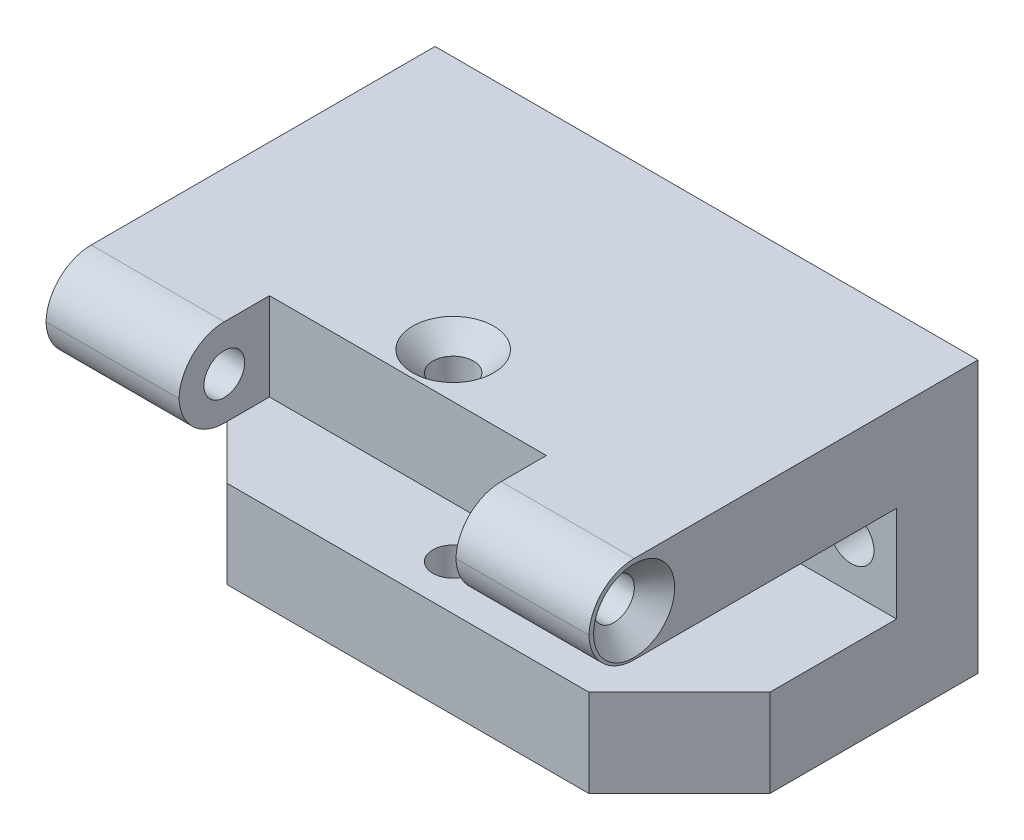
ISO-10303-21;
HEADER;
FILE_DESCRIPTION(('STEP AP214'),'2;1');
FILE_NAME('part.step','',(''),(''),'','','');
FILE_SCHEMA(('AUTOMOTIVE_DESIGN { 1 0 10303 214 1 1 1 1 }'));
ENDSEC;
DATA;
#1=APPLICATION_CONTEXT('core data for automotive mechanical design processes');
#2=APPLICATION_PROTOCOL_DEFINITION('international standard','automotive_design',2000,#1);
#3=PRODUCT_CONTEXT('',#1,'mechanical');
#4=PRODUCT('Part','Part','',(#3));
#5=PRODUCT_RELATED_PRODUCT_CATEGORY('part','',(#4));
#6=PRODUCT_DEFINITION_FORMATION('','',#4);
#7=PRODUCT_DEFINITION_CONTEXT('part definition',#1,'design');
#8=PRODUCT_DEFINITION('design','',#6,#7);
#9=PRODUCT_DEFINITION_SHAPE('','',#8);
#10=(LENGTH_UNIT() NAMED_UNIT(*) SI_UNIT(.MILLI.,.METRE.));
#11=(NAMED_UNIT(*) PLANE_ANGLE_UNIT() SI_UNIT($,.RADIAN.));
#12=(NAMED_UNIT(*) SI_UNIT($,.STERADIAN.) SOLID_ANGLE_UNIT());
#13=UNCERTAINTY_MEASURE_WITH_UNIT(LENGTH_MEASURE(1.E-05),#10,'distance_accuracy_value','');
#14=(GEOMETRIC_REPRESENTATION_CONTEXT(3) GLOBAL_UNCERTAINTY_ASSIGNED_CONTEXT((#13)) GLOBAL_UNIT_ASSIGNED_CONTEXT((#10,
#11,#12)) REPRESENTATION_CONTEXT('',''));
#15=CARTESIAN_POINT('',(0.,0.,0.));
#16=DIRECTION('',(0.,0.,1.));
#17=DIRECTION('',(1.,0.,0.));
#18=AXIS2_PLACEMENT_3D('',#15,#16,#17);
#19=CARTESIAN_POINT('',(30.,-15.,9.));
#20=DIRECTION('',(-1.,0.,0.));
#21=DIRECTION('',(0.,0.,1.));
#22=AXIS2_PLACEMENT_3D('',#19,#20,#21);
#23=PLANE('',#22);
#24=CARTESIAN_POINT('',(30.,9.99999999999999,38.));
#25=DIRECTION('',(-1.,0.,0.));
#26=DIRECTION('',(0.,0.,1.));
#27=AXIS2_PLACEMENT_3D('',#24,#25,#26);
#28=CIRCLE('',#27,5.);
#29=CARTESIAN_POINT('',(30.,15.,38.));
#30=VERTEX_POINT('',#29);
#31=CARTESIAN_POINT('',(30.,10.15,42.9977494935221));
#32=VERTEX_POINT('',#31);
#33=EDGE_CURVE('E354',#30,#32,#28,.F.);
#34=ORIENTED_EDGE('',*,*,#33,.T.);
#35=CARTESIAN_POINT('',(30.,10.3,38.));
#36=DIRECTION('',(-1.,0.,0.));
#37=DIRECTION('',(0.,0.,1.));
#38=AXIS2_PLACEMENT_3D('',#35,#36,#37);
#39=CIRCLE('',#38,5.);
#40=CARTESIAN_POINT('',(30.,5.3,38.));
#41=VERTEX_POINT('',#40);
#42=EDGE_CURVE('E357',#32,#41,#39,.F.);
#43=ORIENTED_EDGE('',*,*,#42,.T.);
#44=DIRECTION('',(0.,0.,-1.));
#45=VECTOR('',#44,1.);
#46=CARTESIAN_POINT('',(30.,5.3,33.));
#47=LINE('',#46,#45);
#48=CARTESIAN_POINT('',(30.,5.3,9.));
#49=VERTEX_POINT('',#48);
#50=EDGE_CURVE('E257',#41,#49,#47,.T.);
#51=ORIENTED_EDGE('',*,*,#50,.T.);
#52=DIRECTION('',(0.,1.,0.));
#53=VECTOR('',#52,1.);
#54=CARTESIAN_POINT('',(30.,-15.,9.));
#55=LINE('',#54,#53);
#56=CARTESIAN_POINT('',(30.,-5.3,9.));
#57=VERTEX_POINT('',#56);
#58=EDGE_CURVE('E267',#57,#49,#55,.T.);
#59=ORIENTED_EDGE('',*,*,#58,.F.);
#60=DIRECTION('',(0.,0.,-1.));
#61=VECTOR('',#60,1.);
#62=CARTESIAN_POINT('',(30.,-5.3,33.));
#63=LINE('',#62,#61);
#64=CARTESIAN_POINT('',(30.,-5.3,23.));
#65=VERTEX_POINT('',#64);
#66=EDGE_CURVE('E252',#65,#57,#63,.T.);
#67=ORIENTED_EDGE('',*,*,#66,.F.);
#68=DIRECTION('',(0.,-1.,0.));
#69=VECTOR('',#68,1.);
#70=CARTESIAN_POINT('',(30.,-15.,23.));
#71=LINE('',#70,#69);
#72=CARTESIAN_POINT('',(30.,-15.,23.));
#73=VERTEX_POINT('',#72);
#74=EDGE_CURVE('E325',#65,#73,#71,.T.);
#75=ORIENTED_EDGE('',*,*,#74,.T.);
#76=DIRECTION('',(0.,0.,-1.));
#77=VECTOR('',#76,1.);
#78=CARTESIAN_POINT('',(30.,-15.,9.));
#79=LINE('',#78,#77);
#80=CARTESIAN_POINT('',(30.,-15.,0.));
#81=VERTEX_POINT('',#80);
#82=EDGE_CURVE('E276',#73,#81,#79,.T.);
#83=ORIENTED_EDGE('',*,*,#82,.T.);
#84=DIRECTION('',(0.,1.,0.));
#85=VECTOR('',#84,1.);
#86=CARTESIAN_POINT('',(30.,-15.,0.));
#87=LINE('',#86,#85);
#88=CARTESIAN_POINT('',(30.,15.,0.));
#89=VERTEX_POINT('',#88);
#90=EDGE_CURVE('E266',#81,#89,#87,.T.);
#91=ORIENTED_EDGE('',*,*,#90,.T.);
#92=DIRECTION('',(0.,0.,-1.));
#93=VECTOR('',#92,1.);
#94=CARTESIAN_POINT('',(30.,15.,9.));
#95=LINE('',#94,#93);
#96=EDGE_CURVE('E299',#30,#89,#95,.T.);
#97=ORIENTED_EDGE('',*,*,#96,.F.);
#98=EDGE_LOOP('',(#34,#43,#51,#59,#67,#75,#83,#91,#97));
#99=FACE_BOUND('',#98,.T.);
#100=CARTESIAN_POINT('',(30.,9.99999999999999,38.));
#101=DIRECTION('',(1.,0.,0.));
#102=DIRECTION('',(0.,0.,-1.));
#103=AXIS2_PLACEMENT_3D('',#100,#101,#102);
#104=CIRCLE('',#103,4.48);
#105=CARTESIAN_POINT('',(30.,9.99999999999999,33.52));
#106=VERTEX_POINT('',#105);
#107=EDGE_CURVE('E374',#106,#106,#104,.T.);
#108=ORIENTED_EDGE('',*,*,#107,.F.);
#109=EDGE_LOOP('',(#108));
#110=FACE_BOUND('',#109,.T.);
#111=ADVANCED_FACE('F41',(#99,#110),#23,.F.);
#112=CARTESIAN_POINT('',(-30.,-15.,9.));
#113=DIRECTION('',(1.,0.,0.));
#114=DIRECTION('',(0.,0.,-1.));
#115=AXIS2_PLACEMENT_3D('',#112,#113,#114);
#116=PLANE('',#115);
#117=DIRECTION('',(0.,0.,-1.));
#118=VECTOR('',#117,1.);
#119=CARTESIAN_POINT('',(-30.,5.3,33.));
#120=LINE('',#119,#118);
#121=CARTESIAN_POINT('',(-30.,5.3,38.));
#122=VERTEX_POINT('',#121);
#123=CARTESIAN_POINT('',(-30.,5.3,9.));
#124=VERTEX_POINT('',#123);
#125=EDGE_CURVE('E263',#122,#124,#120,.T.);
#126=ORIENTED_EDGE('',*,*,#125,.F.);
#127=CARTESIAN_POINT('',(-30.,10.3,38.));
#128=DIRECTION('',(1.,0.,0.));
#129=DIRECTION('',(0.,0.,-1.));
#130=AXIS2_PLACEMENT_3D('',#127,#128,#129);
#131=CIRCLE('',#130,5.);
#132=CARTESIAN_POINT('',(-30.,10.15,42.9977494935221));
#133=VERTEX_POINT('',#132);
#134=EDGE_CURVE('E11',#122,#133,#131,.F.);
#135=ORIENTED_EDGE('',*,*,#134,.T.);
#136=CARTESIAN_POINT('',(-30.,9.99999999999999,38.));
#137=DIRECTION('',(1.,0.,0.));
#138=DIRECTION('',(0.,0.,-1.));
#139=AXIS2_PLACEMENT_3D('',#136,#137,#138);
#140=CIRCLE('',#139,5.);
#141=CARTESIAN_POINT('',(-30.,15.,38.));
#142=VERTEX_POINT('',#141);
#143=EDGE_CURVE('E51',#133,#142,#140,.F.);
#144=ORIENTED_EDGE('',*,*,#143,.T.);
#145=DIRECTION('',(0.,0.,-1.));
#146=VECTOR('',#145,1.);
#147=CARTESIAN_POINT('',(-30.,15.,9.));
#148=LINE('',#147,#146);
#149=CARTESIAN_POINT('',(-30.,15.,0.));
#150=VERTEX_POINT('',#149);
#151=EDGE_CURVE('E296',#142,#150,#148,.T.);
#152=ORIENTED_EDGE('',*,*,#151,.T.);
#153=DIRECTION('',(0.,-1.,0.));
#154=VECTOR('',#153,1.);
#155=CARTESIAN_POINT('',(-30.,-15.,0.));
#156=LINE('',#155,#154);
#157=CARTESIAN_POINT('',(-30.,-15.,0.));
#158=VERTEX_POINT('',#157);
#159=EDGE_CURVE('E284',#150,#158,#156,.T.);
#160=ORIENTED_EDGE('',*,*,#159,.T.);
#161=DIRECTION('',(0.,0.,-1.));
#162=VECTOR('',#161,1.);
#163=CARTESIAN_POINT('',(-30.,-15.,9.));
#164=LINE('',#163,#162);
#165=CARTESIAN_POINT('',(-30.,-15.,23.));
#166=VERTEX_POINT('',#165);
#167=EDGE_CURVE('E293',#166,#158,#164,.T.);
#168=ORIENTED_EDGE('',*,*,#167,.F.);
#169=DIRECTION('',(0.,1.,0.));
#170=VECTOR('',#169,1.);
#171=CARTESIAN_POINT('',(-30.,-5.3,23.));
#172=LINE('',#171,#170);
#173=CARTESIAN_POINT('',(-30.,-5.3,23.));
#174=VERTEX_POINT('',#173);
#175=EDGE_CURVE('E316',#166,#174,#172,.T.);
#176=ORIENTED_EDGE('',*,*,#175,.T.);
#177=DIRECTION('',(0.,0.,-1.));
#178=VECTOR('',#177,1.);
#179=CARTESIAN_POINT('',(-30.,-5.3,33.));
#180=LINE('',#179,#178);
#181=CARTESIAN_POINT('',(-30.,-5.3,9.));
#182=VERTEX_POINT('',#181);
#183=EDGE_CURVE('E246',#174,#182,#180,.T.);
#184=ORIENTED_EDGE('',*,*,#183,.T.);
#185=DIRECTION('',(0.,-1.,0.));
#186=VECTOR('',#185,1.);
#187=CARTESIAN_POINT('',(-30.,-15.,9.));
#188=LINE('',#187,#186);
#189=EDGE_CURVE('E271',#124,#182,#188,.T.);
#190=ORIENTED_EDGE('',*,*,#189,.F.);
#191=EDGE_LOOP('',(#126,#135,#144,#152,#160,#168,#176,#184,#190));
#192=FACE_BOUND('',#191,.T.);
#193=CARTESIAN_POINT('',(-30.,9.99999999999999,38.));
#194=DIRECTION('',(-1.,0.,0.));
#195=DIRECTION('',(0.,0.,1.));
#196=AXIS2_PLACEMENT_3D('',#193,#194,#195);
#197=CIRCLE('',#196,4.48);
#198=CARTESIAN_POINT('',(-30.,9.99999999999999,42.48));
#199=VERTEX_POINT('',#198);
#200=EDGE_CURVE('E448',#199,#199,#197,.T.);
#201=ORIENTED_EDGE('',*,*,#200,.F.);
#202=EDGE_LOOP('',(#201));
#203=FACE_BOUND('',#202,.T.);
#204=ADVANCED_FACE('F389',(#192,#203),#116,.F.);
#205=CARTESIAN_POINT('',(0.,0.,33.));
#206=DIRECTION('',(0.,0.,-1.));
#207=DIRECTION('',(-1.,0.,0.));
#208=AXIS2_PLACEMENT_3D('',#205,#206,#207);
#209=PLANE('',#208);
#210=DIRECTION('',(1.,0.,0.));
#211=VECTOR('',#210,1.);
#212=CARTESIAN_POINT('',(-30.,5.3,33.));
#213=LINE('',#212,#211);
#214=CARTESIAN_POINT('',(-15.3,5.3,33.));
#215=VERTEX_POINT('',#214);
#216=CARTESIAN_POINT('',(15.3,5.3,33.));
#217=VERTEX_POINT('',#216);
#218=EDGE_CURVE('E177',#215,#217,#213,.T.);
#219=ORIENTED_EDGE('',*,*,#218,.T.);
#220=DIRECTION('',(0.,1.,0.));
#221=VECTOR('',#220,1.);
#222=CARTESIAN_POINT('',(15.3,15.,33.));
#223=LINE('',#222,#221);
#224=CARTESIAN_POINT('',(15.3,15.,33.));
#225=VERTEX_POINT('',#224);
#226=EDGE_CURVE('E175',#217,#225,#223,.T.);
#227=ORIENTED_EDGE('',*,*,#226,.T.);
#228=DIRECTION('',(-1.,0.,0.));
#229=VECTOR('',#228,1.);
#230=CARTESIAN_POINT('',(-30.,15.,33.));
#231=LINE('',#230,#229);
#232=CARTESIAN_POINT('',(-15.3,15.,33.));
#233=VERTEX_POINT('',#232);
#234=EDGE_CURVE('E159',#225,#233,#231,.T.);
#235=ORIENTED_EDGE('',*,*,#234,.T.);
#236=DIRECTION('',(0.,1.,0.));
#237=VECTOR('',#236,1.);
#238=CARTESIAN_POINT('',(-15.3,15.,33.));
#239=LINE('',#238,#237);
#240=EDGE_CURVE('E166',#215,#233,#239,.T.);
#241=ORIENTED_EDGE('',*,*,#240,.F.);
#242=EDGE_LOOP('',(#219,#227,#235,#241));
#243=FACE_BOUND('',#242,.T.);
#244=ADVANCED_FACE('F172',(#243),#209,.F.);
#245=CARTESIAN_POINT('',(0.,0.,9.));
#246=DIRECTION('',(0.,0.,-1.));
#247=DIRECTION('',(-1.,0.,0.));
#248=AXIS2_PLACEMENT_3D('',#245,#246,#247);
#249=PLANE('',#248);
#250=CARTESIAN_POINT('',(-25.,0.,9.));
#251=DIRECTION('',(0.,0.,1.));
#252=DIRECTION('',(1.,0.,0.));
#253=AXIS2_PLACEMENT_3D('',#250,#251,#252);
#254=CIRCLE('',#253,2.5);
#255=CARTESIAN_POINT('',(-22.5,0.,9.));
#256=VERTEX_POINT('',#255);
#257=EDGE_CURVE('E193',#256,#256,#254,.T.);
#258=ORIENTED_EDGE('',*,*,#257,.F.);
#259=EDGE_LOOP('',(#258));
#260=FACE_BOUND('',#259,.T.);
#261=CARTESIAN_POINT('',(25.,0.,9.));
#262=DIRECTION('',(0.,0.,1.));
#263=DIRECTION('',(1.,0.,0.));
#264=AXIS2_PLACEMENT_3D('',#261,#262,#263);
#265=CIRCLE('',#264,2.5);
#266=CARTESIAN_POINT('',(27.5,0.,9.));
#267=VERTEX_POINT('',#266);
#268=EDGE_CURVE('E206',#267,#267,#265,.T.);
#269=ORIENTED_EDGE('',*,*,#268,.F.);
#270=EDGE_LOOP('',(#269));
#271=FACE_BOUND('',#270,.T.);
#272=DIRECTION('',(-1.,0.,0.));
#273=VECTOR('',#272,1.);
#274=CARTESIAN_POINT('',(-30.,-5.3,9.));
#275=LINE('',#274,#273);
#276=EDGE_CURVE('E242',#57,#182,#275,.T.);
#277=ORIENTED_EDGE('',*,*,#276,.F.);
#278=ORIENTED_EDGE('',*,*,#58,.T.);
#279=DIRECTION('',(1.,0.,0.));
#280=VECTOR('',#279,1.);
#281=CARTESIAN_POINT('',(-30.,5.3,9.));
#282=LINE('',#281,#280);
#283=EDGE_CURVE('E178',#124,#49,#282,.T.);
#284=ORIENTED_EDGE('',*,*,#283,.F.);
#285=ORIENTED_EDGE('',*,*,#189,.T.);
#286=EDGE_LOOP('',(#277,#278,#284,#285));
#287=FACE_BOUND('',#286,.T.);
#288=ADVANCED_FACE('F426',(#260,#271,#287),#249,.F.);
#289=CARTESIAN_POINT('',(-30.,15.,9.));
#290=DIRECTION('',(0.,-1.,0.));
#291=DIRECTION('',(0.,0.,-1.));
#292=AXIS2_PLACEMENT_3D('',#289,#290,#291);
#293=PLANE('',#292);
#294=CARTESIAN_POINT('',(0.,15.,28.));
#295=DIRECTION('',(0.,1.,0.));
#296=DIRECTION('',(0.,0.,1.));
#297=AXIS2_PLACEMENT_3D('',#294,#295,#296);
#298=CIRCLE('',#297,4.48);
#299=CARTESIAN_POINT('',(0.,15.,32.48));
#300=VERTEX_POINT('',#299);
#301=EDGE_CURVE('E219',#300,#300,#298,.T.);
#302=ORIENTED_EDGE('',*,*,#301,.F.);
#303=EDGE_LOOP('',(#302));
#304=FACE_BOUND('',#303,.T.);
#305=DIRECTION('',(0.,0.,-1.));
#306=VECTOR('',#305,1.);
#307=CARTESIAN_POINT('',(15.3,15.,43.));
#308=LINE('',#307,#306);
#309=CARTESIAN_POINT('',(15.3,15.,38.));
#310=VERTEX_POINT('',#309);
#311=EDGE_CURVE('E435',#310,#225,#308,.T.);
#312=ORIENTED_EDGE('',*,*,#311,.F.);
#313=DIRECTION('',(1.,0.,0.));
#314=VECTOR('',#313,1.);
#315=CARTESIAN_POINT('',(30.,15.,38.));
#316=LINE('',#315,#314);
#317=EDGE_CURVE('E362',#310,#30,#316,.T.);
#318=ORIENTED_EDGE('',*,*,#317,.T.);
#319=ORIENTED_EDGE('',*,*,#96,.T.);
#320=DIRECTION('',(-1.,0.,0.));
#321=VECTOR('',#320,1.);
#322=CARTESIAN_POINT('',(-30.,15.,0.));
#323=LINE('',#322,#321);
#324=EDGE_CURVE('E280',#89,#150,#323,.T.);
#325=ORIENTED_EDGE('',*,*,#324,.T.);
#326=ORIENTED_EDGE('',*,*,#151,.F.);
#327=DIRECTION('',(-1.,0.,0.));
#328=VECTOR('',#327,1.);
#329=CARTESIAN_POINT('',(-15.3,15.,38.));
#330=LINE('',#329,#328);
#331=CARTESIAN_POINT('',(-15.3,15.,38.));
#332=VERTEX_POINT('',#331);
#333=EDGE_CURVE('E162',#142,#332,#330,.F.);
#334=ORIENTED_EDGE('',*,*,#333,.T.);
#335=DIRECTION('',(0.,0.,-1.));
#336=VECTOR('',#335,1.);
#337=CARTESIAN_POINT('',(-15.3,15.,43.));
#338=LINE('',#337,#336);
#339=EDGE_CURVE('E155',#332,#233,#338,.T.);
#340=ORIENTED_EDGE('',*,*,#339,.T.);
#341=ORIENTED_EDGE('',*,*,#234,.F.);
#342=EDGE_LOOP('',(#312,#318,#319,#325,#326,#334,#340,#341));
#343=FACE_BOUND('',#342,.T.);
#344=ADVANCED_FACE('F158',(#304,#343),#293,.F.);
#345=CARTESIAN_POINT('',(-30.,-15.,9.));
#346=DIRECTION('',(0.,1.,0.));
#347=DIRECTION('',(0.,0.,1.));
#348=AXIS2_PLACEMENT_3D('',#345,#346,#347);
#349=PLANE('',#348);
#350=CARTESIAN_POINT('',(0.,-15.,28.));
#351=DIRECTION('',(0.,-1.,0.));
#352=DIRECTION('',(0.,0.,-1.));
#353=AXIS2_PLACEMENT_3D('',#350,#351,#352);
#354=CIRCLE('',#353,4.48);
#355=CARTESIAN_POINT('',(0.,-15.,23.52));
#356=VERTEX_POINT('',#355);
#357=EDGE_CURVE('E228',#356,#356,#354,.T.);
#358=ORIENTED_EDGE('',*,*,#357,.F.);
#359=EDGE_LOOP('',(#358));
#360=FACE_BOUND('',#359,.T.);
#361=DIRECTION('',(1.,0.,0.));
#362=VECTOR('',#361,1.);
#363=CARTESIAN_POINT('',(-30.,-15.,33.));
#364=LINE('',#363,#362);
#365=CARTESIAN_POINT('',(-20.,-15.,33.));
#366=VERTEX_POINT('',#365);
#367=CARTESIAN_POINT('',(20.,-15.,33.));
#368=VERTEX_POINT('',#367);
#369=EDGE_CURVE('E241',#366,#368,#364,.T.);
#370=ORIENTED_EDGE('',*,*,#369,.F.);
#371=DIRECTION('',(-0.707106781186546,0.,-0.707106781186549));
#372=VECTOR('',#371,1.);
#373=CARTESIAN_POINT('',(-20.,-15.,33.));
#374=LINE('',#373,#372);
#375=EDGE_CURVE('E313',#366,#166,#374,.T.);
#376=ORIENTED_EDGE('',*,*,#375,.T.);
#377=ORIENTED_EDGE('',*,*,#167,.T.);
#378=DIRECTION('',(1.,0.,0.));
#379=VECTOR('',#378,1.);
#380=CARTESIAN_POINT('',(-30.,-15.,0.));
#381=LINE('',#380,#379);
#382=EDGE_CURVE('E272',#158,#81,#381,.T.);
#383=ORIENTED_EDGE('',*,*,#382,.T.);
#384=ORIENTED_EDGE('',*,*,#82,.F.);
#385=DIRECTION('',(-0.707106781186546,0.,0.707106781186549));
#386=VECTOR('',#385,1.);
#387=CARTESIAN_POINT('',(20.,-15.,33.));
#388=LINE('',#387,#386);
#389=EDGE_CURVE('E310',#73,#368,#388,.T.);
#390=ORIENTED_EDGE('',*,*,#389,.T.);
#391=EDGE_LOOP('',(#370,#376,#377,#383,#384,#390));
#392=FACE_BOUND('',#391,.T.);
#393=ADVANCED_FACE('F472',(#360,#392),#349,.F.);
#394=CARTESIAN_POINT('',(0.,0.,0.));
#395=DIRECTION('',(0.,0.,-1.));
#396=DIRECTION('',(-1.,0.,0.));
#397=AXIS2_PLACEMENT_3D('',#394,#395,#396);
#398=PLANE('',#397);
#399=CARTESIAN_POINT('',(-25.,0.,0.));
#400=DIRECTION('',(0.,0.,-1.));
#401=DIRECTION('',(-1.,0.,0.));
#402=AXIS2_PLACEMENT_3D('',#399,#400,#401);
#403=CIRCLE('',#402,2.25);
#404=CARTESIAN_POINT('',(-27.25,0.,0.));
#405=VERTEX_POINT('',#404);
#406=EDGE_CURVE('E205',#405,#405,#403,.T.);
#407=ORIENTED_EDGE('',*,*,#406,.F.);
#408=EDGE_LOOP('',(#407));
#409=FACE_BOUND('',#408,.T.);
#410=CARTESIAN_POINT('',(25.,0.,0.));
#411=DIRECTION('',(0.,0.,-1.));
#412=DIRECTION('',(-1.,0.,0.));
#413=AXIS2_PLACEMENT_3D('',#410,#411,#412);
#414=CIRCLE('',#413,2.25);
#415=CARTESIAN_POINT('',(22.75,0.,0.));
#416=VERTEX_POINT('',#415);
#417=EDGE_CURVE('E218',#416,#416,#414,.T.);
#418=ORIENTED_EDGE('',*,*,#417,.F.);
#419=EDGE_LOOP('',(#418));
#420=FACE_BOUND('',#419,.T.);
#421=ORIENTED_EDGE('',*,*,#90,.F.);
#422=ORIENTED_EDGE('',*,*,#382,.F.);
#423=ORIENTED_EDGE('',*,*,#159,.F.);
#424=ORIENTED_EDGE('',*,*,#324,.F.);
#425=EDGE_LOOP('',(#421,#422,#423,#424));
#426=FACE_BOUND('',#425,.T.);
#427=ADVANCED_FACE('F397',(#409,#420,#426),#398,.T.);
#428=CARTESIAN_POINT('',(-30.,5.3,33.));
#429=DIRECTION('',(0.,1.,0.));
#430=DIRECTION('',(0.,0.,1.));
#431=AXIS2_PLACEMENT_3D('',#428,#429,#430);
#432=PLANE('',#431);
#433=CARTESIAN_POINT('',(0.,5.3,28.));
#434=DIRECTION('',(0.,1.,0.));
#435=DIRECTION('',(0.,0.,1.));
#436=AXIS2_PLACEMENT_3D('',#433,#434,#435);
#437=CIRCLE('',#436,2.25);
#438=CARTESIAN_POINT('',(0.,5.3,30.25));
#439=VERTEX_POINT('',#438);
#440=EDGE_CURVE('E227',#439,#439,#437,.T.);
#441=ORIENTED_EDGE('',*,*,#440,.T.);
#442=EDGE_LOOP('',(#441));
#443=FACE_BOUND('',#442,.T.);
#444=ORIENTED_EDGE('',*,*,#50,.F.);
#445=DIRECTION('',(-1.,0.,0.));
#446=VECTOR('',#445,1.);
#447=CARTESIAN_POINT('',(15.3,5.3,38.));
#448=LINE('',#447,#446);
#449=CARTESIAN_POINT('',(15.3,5.3,38.));
#450=VERTEX_POINT('',#449);
#451=EDGE_CURVE('E344',#41,#450,#448,.T.);
#452=ORIENTED_EDGE('',*,*,#451,.T.);
#453=DIRECTION('',(0.,0.,-1.));
#454=VECTOR('',#453,1.);
#455=CARTESIAN_POINT('',(15.3,5.3,43.));
#456=LINE('',#455,#454);
#457=EDGE_CURVE('E432',#450,#217,#456,.T.);
#458=ORIENTED_EDGE('',*,*,#457,.T.);
#459=ORIENTED_EDGE('',*,*,#218,.F.);
#460=DIRECTION('',(0.,0.,-1.));
#461=VECTOR('',#460,1.);
#462=CARTESIAN_POINT('',(-15.3,5.3,43.));
#463=LINE('',#462,#461);
#464=CARTESIAN_POINT('',(-15.3,5.3,38.));
#465=VERTEX_POINT('',#464);
#466=EDGE_CURVE('E165',#465,#215,#463,.T.);
#467=ORIENTED_EDGE('',*,*,#466,.F.);
#468=DIRECTION('',(1.,0.,0.));
#469=VECTOR('',#468,1.);
#470=CARTESIAN_POINT('',(-30.,5.3,38.));
#471=LINE('',#470,#469);
#472=EDGE_CURVE('E328',#465,#122,#471,.F.);
#473=ORIENTED_EDGE('',*,*,#472,.T.);
#474=ORIENTED_EDGE('',*,*,#125,.T.);
#475=ORIENTED_EDGE('',*,*,#283,.T.);
#476=EDGE_LOOP('',(#444,#452,#458,#459,#467,#473,#474,#475));
#477=FACE_BOUND('',#476,.T.);
#478=ADVANCED_FACE('F429',(#443,#477),#432,.F.);
#479=CARTESIAN_POINT('',(-30.,-5.3,33.));
#480=DIRECTION('',(0.,-1.,0.));
#481=DIRECTION('',(0.,0.,-1.));
#482=AXIS2_PLACEMENT_3D('',#479,#480,#481);
#483=PLANE('',#482);
#484=CARTESIAN_POINT('',(0.,-5.3,28.));
#485=DIRECTION('',(0.,-1.,0.));
#486=DIRECTION('',(0.,0.,-1.));
#487=AXIS2_PLACEMENT_3D('',#484,#485,#486);
#488=CIRCLE('',#487,2.24999999999999);
#489=CARTESIAN_POINT('',(0.,-5.3,25.75));
#490=VERTEX_POINT('',#489);
#491=EDGE_CURVE('E236',#490,#490,#488,.T.);
#492=ORIENTED_EDGE('',*,*,#491,.T.);
#493=EDGE_LOOP('',(#492));
#494=FACE_BOUND('',#493,.T.);
#495=ORIENTED_EDGE('',*,*,#183,.F.);
#496=DIRECTION('',(0.707106781186546,0.,0.707106781186549));
#497=VECTOR('',#496,1.);
#498=CARTESIAN_POINT('',(-20.,-5.3,33.));
#499=LINE('',#498,#497);
#500=CARTESIAN_POINT('',(-20.,-5.3,33.));
#501=VERTEX_POINT('',#500);
#502=EDGE_CURVE('E322',#174,#501,#499,.T.);
#503=ORIENTED_EDGE('',*,*,#502,.T.);
#504=DIRECTION('',(-1.,0.,0.));
#505=VECTOR('',#504,1.);
#506=CARTESIAN_POINT('',(-30.,-5.3,33.));
#507=LINE('',#506,#505);
#508=CARTESIAN_POINT('',(20.,-5.3,33.));
#509=VERTEX_POINT('',#508);
#510=EDGE_CURVE('E237',#509,#501,#507,.T.);
#511=ORIENTED_EDGE('',*,*,#510,.F.);
#512=DIRECTION('',(0.707106781186546,0.,-0.707106781186549));
#513=VECTOR('',#512,1.);
#514=CARTESIAN_POINT('',(20.,-5.3,33.));
#515=LINE('',#514,#513);
#516=EDGE_CURVE('E319',#509,#65,#515,.T.);
#517=ORIENTED_EDGE('',*,*,#516,.T.);
#518=ORIENTED_EDGE('',*,*,#66,.T.);
#519=ORIENTED_EDGE('',*,*,#276,.T.);
#520=EDGE_LOOP('',(#495,#503,#511,#517,#518,#519));
#521=FACE_BOUND('',#520,.T.);
#522=ADVANCED_FACE('F408',(#494,#521),#483,.F.);
#523=CARTESIAN_POINT('',(0.,0.,33.));
#524=DIRECTION('',(0.,0.,1.));
#525=DIRECTION('',(1.,0.,0.));
#526=AXIS2_PLACEMENT_3D('',#523,#524,#525);
#527=PLANE('',#526);
#528=ORIENTED_EDGE('',*,*,#510,.T.);
#529=DIRECTION('',(0.,-1.,0.));
#530=VECTOR('',#529,1.);
#531=CARTESIAN_POINT('',(-20.,-15.,33.));
#532=LINE('',#531,#530);
#533=EDGE_CURVE('E306',#501,#366,#532,.T.);
#534=ORIENTED_EDGE('',*,*,#533,.T.);
#535=ORIENTED_EDGE('',*,*,#369,.T.);
#536=DIRECTION('',(0.,1.,0.));
#537=VECTOR('',#536,1.);
#538=CARTESIAN_POINT('',(20.,-5.3,33.));
#539=LINE('',#538,#537);
#540=EDGE_CURVE('E302',#368,#509,#539,.T.);
#541=ORIENTED_EDGE('',*,*,#540,.T.);
#542=EDGE_LOOP('',(#528,#534,#535,#541));
#543=FACE_BOUND('',#542,.T.);
#544=ADVANCED_FACE('F410',(#543),#527,.T.);
#545=CARTESIAN_POINT('',(-20.,0.,33.));
#546=DIRECTION('',(-0.707106781186549,0.,0.707106781186546));
#547=DIRECTION('',(0.,1.,0.));
#548=AXIS2_PLACEMENT_3D('',#545,#546,#547);
#549=PLANE('',#548);
#550=ORIENTED_EDGE('',*,*,#502,.F.);
#551=ORIENTED_EDGE('',*,*,#175,.F.);
#552=ORIENTED_EDGE('',*,*,#375,.F.);
#553=ORIENTED_EDGE('',*,*,#533,.F.);
#554=EDGE_LOOP('',(#550,#551,#552,#553));
#555=FACE_BOUND('',#554,.T.);
#556=ADVANCED_FACE('F404',(#555),#549,.T.);
#557=CARTESIAN_POINT('',(20.,0.,33.));
#558=DIRECTION('',(0.707106781186549,0.,0.707106781186546));
#559=DIRECTION('',(0.,-1.,0.));
#560=AXIS2_PLACEMENT_3D('',#557,#558,#559);
#561=PLANE('',#560);
#562=ORIENTED_EDGE('',*,*,#389,.F.);
#563=ORIENTED_EDGE('',*,*,#74,.F.);
#564=ORIENTED_EDGE('',*,*,#516,.F.);
#565=ORIENTED_EDGE('',*,*,#540,.F.);
#566=EDGE_LOOP('',(#562,#563,#564,#565));
#567=FACE_BOUND('',#566,.T.);
#568=ADVANCED_FACE('F415',(#567),#561,.T.);
#569=CARTESIAN_POINT('',(0.,-15.,28.));
#570=DIRECTION('',(0.,-1.,0.));
#571=DIRECTION('',(0.,0.,-1.));
#572=AXIS2_PLACEMENT_3D('',#569,#570,#571);
#573=CYLINDRICAL_SURFACE('',#572,2.24999999999999);
#574=CARTESIAN_POINT('',(0.,-12.77,28.));
#575=DIRECTION('',(0.,-1.,0.));
#576=DIRECTION('',(0.,0.,-1.));
#577=AXIS2_PLACEMENT_3D('',#574,#575,#576);
#578=CIRCLE('',#577,2.25);
#579=CARTESIAN_POINT('',(0.,-12.77,25.75));
#580=VERTEX_POINT('',#579);
#581=EDGE_CURVE('E232',#580,#580,#578,.T.);
#582=ORIENTED_EDGE('',*,*,#581,.T.);
#583=EDGE_LOOP('',(#582));
#584=FACE_BOUND('',#583,.T.);
#585=ORIENTED_EDGE('',*,*,#491,.F.);
#586=EDGE_LOOP('',(#585));
#587=FACE_BOUND('',#586,.T.);
#588=ADVANCED_FACE('F487',(#584,#587),#573,.F.);
#589=CARTESIAN_POINT('',(0.,-15.,28.));
#590=DIRECTION('',(0.,-1.,0.));
#591=DIRECTION('',(0.,0.,-1.));
#592=AXIS2_PLACEMENT_3D('',#589,#590,#591);
#593=CONICAL_SURFACE('',#592,4.48,0.785398163397448);
#594=ORIENTED_EDGE('',*,*,#581,.F.);
#595=EDGE_LOOP('',(#594));
#596=FACE_BOUND('',#595,.T.);
#597=ORIENTED_EDGE('',*,*,#357,.T.);
#598=EDGE_LOOP('',(#597));
#599=FACE_BOUND('',#598,.T.);
#600=ADVANCED_FACE('F617',(#596,#599),#593,.F.);
#601=CARTESIAN_POINT('',(0.,15.,28.));
#602=DIRECTION('',(0.,1.,0.));
#603=DIRECTION('',(0.,0.,1.));
#604=AXIS2_PLACEMENT_3D('',#601,#602,#603);
#605=CYLINDRICAL_SURFACE('',#604,2.25);
#606=CARTESIAN_POINT('',(0.,12.77,28.));
#607=DIRECTION('',(0.,1.,0.));
#608=DIRECTION('',(0.,0.,1.));
#609=AXIS2_PLACEMENT_3D('',#606,#607,#608);
#610=CIRCLE('',#609,2.25);
#611=CARTESIAN_POINT('',(0.,12.77,30.25));
#612=VERTEX_POINT('',#611);
#613=EDGE_CURVE('E223',#612,#612,#610,.T.);
#614=ORIENTED_EDGE('',*,*,#613,.T.);
#615=EDGE_LOOP('',(#614));
#616=FACE_BOUND('',#615,.T.);
#617=ORIENTED_EDGE('',*,*,#440,.F.);
#618=EDGE_LOOP('',(#617));
#619=FACE_BOUND('',#618,.T.);
#620=ADVANCED_FACE('F608',(#616,#619),#605,.F.);
#621=CARTESIAN_POINT('',(0.,15.,28.));
#622=DIRECTION('',(0.,1.,0.));
#623=DIRECTION('',(0.,0.,1.));
#624=AXIS2_PLACEMENT_3D('',#621,#622,#623);
#625=CONICAL_SURFACE('',#624,4.48,0.785398163397448);
#626=ORIENTED_EDGE('',*,*,#613,.F.);
#627=EDGE_LOOP('',(#626));
#628=FACE_BOUND('',#627,.T.);
#629=ORIENTED_EDGE('',*,*,#301,.T.);
#630=EDGE_LOOP('',(#629));
#631=FACE_BOUND('',#630,.T.);
#632=ADVANCED_FACE('F599',(#628,#631),#625,.F.);
#633=CARTESIAN_POINT('',(25.,0.,9.));
#634=DIRECTION('',(0.,0.,1.));
#635=DIRECTION('',(1.,0.,0.));
#636=AXIS2_PLACEMENT_3D('',#633,#634,#635);
#637=CYLINDRICAL_SURFACE('',#636,2.25);
#638=ORIENTED_EDGE('',*,*,#417,.T.);
#639=EDGE_LOOP('',(#638));
#640=FACE_BOUND('',#639,.T.);
#641=CARTESIAN_POINT('',(25.,0.,4.8));
#642=DIRECTION('',(0.,0.,1.));
#643=DIRECTION('',(1.,0.,0.));
#644=AXIS2_PLACEMENT_3D('',#641,#642,#643);
#645=CIRCLE('',#644,2.25);
#646=CARTESIAN_POINT('',(27.25,0.,4.8));
#647=VERTEX_POINT('',#646);
#648=EDGE_CURVE('E214',#647,#647,#645,.T.);
#649=ORIENTED_EDGE('',*,*,#648,.T.);
#650=EDGE_LOOP('',(#649));
#651=FACE_BOUND('',#650,.T.);
#652=ADVANCED_FACE('F591',(#640,#651),#637,.F.);
#653=CARTESIAN_POINT('',(27.25,0.,4.8));
#654=DIRECTION('',(0.,0.,-1.));
#655=DIRECTION('',(-1.,0.,0.));
#656=AXIS2_PLACEMENT_3D('',#653,#654,#655);
#657=PLANE('',#656);
#658=ORIENTED_EDGE('',*,*,#648,.F.);
#659=EDGE_LOOP('',(#658));
#660=FACE_BOUND('',#659,.T.);
#661=CARTESIAN_POINT('',(25.,0.,4.8));
#662=DIRECTION('',(0.,0.,1.));
#663=DIRECTION('',(1.,0.,0.));
#664=AXIS2_PLACEMENT_3D('',#661,#662,#663);
#665=CIRCLE('',#664,2.5);
#666=CARTESIAN_POINT('',(27.5,0.,4.8));
#667=VERTEX_POINT('',#666);
#668=EDGE_CURVE('E210',#667,#667,#665,.T.);
#669=ORIENTED_EDGE('',*,*,#668,.T.);
#670=EDGE_LOOP('',(#669));
#671=FACE_BOUND('',#670,.T.);
#672=ADVANCED_FACE('F583',(#660,#671),#657,.F.);
#673=CARTESIAN_POINT('',(25.,0.,9.));
#674=DIRECTION('',(0.,0.,1.));
#675=DIRECTION('',(1.,0.,0.));
#676=AXIS2_PLACEMENT_3D('',#673,#674,#675);
#677=CYLINDRICAL_SURFACE('',#676,2.5);
#678=ORIENTED_EDGE('',*,*,#668,.F.);
#679=EDGE_LOOP('',(#678));
#680=FACE_BOUND('',#679,.T.);
#681=ORIENTED_EDGE('',*,*,#268,.T.);
#682=EDGE_LOOP('',(#681));
#683=FACE_BOUND('',#682,.T.);
#684=ADVANCED_FACE('F575',(#680,#683),#677,.F.);
#685=CARTESIAN_POINT('',(-25.,0.,9.));
#686=DIRECTION('',(0.,0.,1.));
#687=DIRECTION('',(1.,0.,0.));
#688=AXIS2_PLACEMENT_3D('',#685,#686,#687);
#689=CYLINDRICAL_SURFACE('',#688,2.25);
#690=ORIENTED_EDGE('',*,*,#406,.T.);
#691=EDGE_LOOP('',(#690));
#692=FACE_BOUND('',#691,.T.);
#693=CARTESIAN_POINT('',(-25.,0.,4.8));
#694=DIRECTION('',(0.,0.,1.));
#695=DIRECTION('',(1.,0.,0.));
#696=AXIS2_PLACEMENT_3D('',#693,#694,#695);
#697=CIRCLE('',#696,2.25);
#698=CARTESIAN_POINT('',(-22.75,0.,4.8));
#699=VERTEX_POINT('',#698);
#700=EDGE_CURVE('E201',#699,#699,#697,.T.);
#701=ORIENTED_EDGE('',*,*,#700,.T.);
#702=EDGE_LOOP('',(#701));
#703=FACE_BOUND('',#702,.T.);
#704=ADVANCED_FACE('F567',(#692,#703),#689,.F.);
#705=CARTESIAN_POINT('',(-22.75,0.,4.8));
#706=DIRECTION('',(0.,0.,-1.));
#707=DIRECTION('',(-1.,0.,0.));
#708=AXIS2_PLACEMENT_3D('',#705,#706,#707);
#709=PLANE('',#708);
#710=ORIENTED_EDGE('',*,*,#700,.F.);
#711=EDGE_LOOP('',(#710));
#712=FACE_BOUND('',#711,.T.);
#713=CARTESIAN_POINT('',(-25.,0.,4.8));
#714=DIRECTION('',(0.,0.,1.));
#715=DIRECTION('',(1.,0.,0.));
#716=AXIS2_PLACEMENT_3D('',#713,#714,#715);
#717=CIRCLE('',#716,2.5);
#718=CARTESIAN_POINT('',(-22.5,0.,4.8));
#719=VERTEX_POINT('',#718);
#720=EDGE_CURVE('E197',#719,#719,#717,.T.);
#721=ORIENTED_EDGE('',*,*,#720,.T.);
#722=EDGE_LOOP('',(#721));
#723=FACE_BOUND('',#722,.T.);
#724=ADVANCED_FACE('F559',(#712,#723),#709,.F.);
#725=CARTESIAN_POINT('',(-25.,0.,9.));
#726=DIRECTION('',(0.,0.,1.));
#727=DIRECTION('',(1.,0.,0.));
#728=AXIS2_PLACEMENT_3D('',#725,#726,#727);
#729=CYLINDRICAL_SURFACE('',#728,2.5);
#730=ORIENTED_EDGE('',*,*,#720,.F.);
#731=EDGE_LOOP('',(#730));
#732=FACE_BOUND('',#731,.T.);
#733=ORIENTED_EDGE('',*,*,#257,.T.);
#734=EDGE_LOOP('',(#733));
#735=FACE_BOUND('',#734,.T.);
#736=ADVANCED_FACE('F551',(#732,#735),#729,.F.);
#737=CARTESIAN_POINT('',(-15.3,15.,43.));
#738=DIRECTION('',(-1.,0.,0.));
#739=DIRECTION('',(0.,-1.,0.));
#740=AXIS2_PLACEMENT_3D('',#737,#738,#739);
#741=PLANE('',#740);
#742=CARTESIAN_POINT('',(-15.3,9.99999999999999,38.));
#743=DIRECTION('',(-1.,0.,0.));
#744=DIRECTION('',(0.,-1.,0.));
#745=AXIS2_PLACEMENT_3D('',#742,#743,#744);
#746=CIRCLE('',#745,2.25);
#747=CARTESIAN_POINT('',(-15.3,7.75,38.));
#748=VERTEX_POINT('',#747);
#749=EDGE_CURVE('E183',#748,#748,#746,.T.);
#750=ORIENTED_EDGE('',*,*,#749,.T.);
#751=EDGE_LOOP('',(#750));
#752=FACE_BOUND('',#751,.T.);
#753=CARTESIAN_POINT('',(-15.3,9.99999999999999,38.));
#754=DIRECTION('',(-1.,0.,0.));
#755=DIRECTION('',(0.,-1.,0.));
#756=AXIS2_PLACEMENT_3D('',#753,#754,#755);
#757=CIRCLE('',#756,5.);
#758=CARTESIAN_POINT('',(-15.3,10.15,42.9977494935221));
#759=VERTEX_POINT('',#758);
#760=EDGE_CURVE('E65',#332,#759,#757,.F.);
#761=ORIENTED_EDGE('',*,*,#760,.T.);
#762=CARTESIAN_POINT('',(-15.3,10.3,38.));
#763=DIRECTION('',(-1.,0.,0.));
#764=DIRECTION('',(0.,-1.,0.));
#765=AXIS2_PLACEMENT_3D('',#762,#763,#764);
#766=CIRCLE('',#765,5.);
#767=EDGE_CURVE('E367',#759,#465,#766,.F.);
#768=ORIENTED_EDGE('',*,*,#767,.T.);
#769=ORIENTED_EDGE('',*,*,#466,.T.);
#770=ORIENTED_EDGE('',*,*,#240,.T.);
#771=ORIENTED_EDGE('',*,*,#339,.F.);
#772=EDGE_LOOP('',(#761,#768,#769,#770,#771));
#773=FACE_BOUND('',#772,.T.);
#774=ADVANCED_FACE('F180',(#752,#773),#741,.F.);
#775=CARTESIAN_POINT('',(-30.,9.99999999999999,38.));
#776=DIRECTION('',(-1.,0.,0.));
#777=DIRECTION('',(0.,0.,1.));
#778=AXIS2_PLACEMENT_3D('',#775,#776,#777);
#779=CYLINDRICAL_SURFACE('',#778,2.25);
#780=ORIENTED_EDGE('',*,*,#749,.F.);
#781=EDGE_LOOP('',(#780));
#782=FACE_BOUND('',#781,.T.);
#783=CARTESIAN_POINT('',(-27.77,9.99999999999999,38.));
#784=DIRECTION('',(-1.,0.,0.));
#785=DIRECTION('',(0.,0.,1.));
#786=AXIS2_PLACEMENT_3D('',#783,#784,#785);
#787=CIRCLE('',#786,2.25);
#788=CARTESIAN_POINT('',(-27.77,9.99999999999999,40.25));
#789=VERTEX_POINT('',#788);
#790=EDGE_CURVE('E187',#789,#789,#787,.T.);
#791=ORIENTED_EDGE('',*,*,#790,.T.);
#792=EDGE_LOOP('',(#791));
#793=FACE_BOUND('',#792,.T.);
#794=ADVANCED_FACE('F455',(#782,#793),#779,.F.);
#795=CARTESIAN_POINT('',(-30.,9.99999999999999,38.));
#796=DIRECTION('',(-1.,0.,0.));
#797=DIRECTION('',(0.,0.,1.));
#798=AXIS2_PLACEMENT_3D('',#795,#796,#797);
#799=CONICAL_SURFACE('',#798,4.48,0.785398163397448);
#800=ORIENTED_EDGE('',*,*,#790,.F.);
#801=EDGE_LOOP('',(#800));
#802=FACE_BOUND('',#801,.T.);
#803=ORIENTED_EDGE('',*,*,#200,.T.);
#804=EDGE_LOOP('',(#803));
#805=FACE_BOUND('',#804,.T.);
#806=ADVANCED_FACE('F457',(#802,#805),#799,.F.);
#807=CARTESIAN_POINT('',(15.3,15.,43.));
#808=DIRECTION('',(-1.,0.,0.));
#809=DIRECTION('',(0.,-1.,0.));
#810=AXIS2_PLACEMENT_3D('',#807,#808,#809);
#811=PLANE('',#810);
#812=CARTESIAN_POINT('',(15.3,9.99999999999999,38.));
#813=DIRECTION('',(-1.,0.,0.));
#814=DIRECTION('',(0.,-1.,0.));
#815=AXIS2_PLACEMENT_3D('',#812,#813,#814);
#816=CIRCLE('',#815,2.25);
#817=CARTESIAN_POINT('',(15.3,7.75,38.));
#818=VERTEX_POINT('',#817);
#819=EDGE_CURVE('E437',#818,#818,#816,.T.);
#820=ORIENTED_EDGE('',*,*,#819,.F.);
#821=EDGE_LOOP('',(#820));
#822=FACE_BOUND('',#821,.T.);
#823=ORIENTED_EDGE('',*,*,#457,.F.);
#824=CARTESIAN_POINT('',(15.3,10.3,38.));
#825=DIRECTION('',(-1.,0.,0.));
#826=DIRECTION('',(0.,-1.,0.));
#827=AXIS2_PLACEMENT_3D('',#824,#825,#826);
#828=CIRCLE('',#827,5.);
#829=CARTESIAN_POINT('',(15.3,10.15,42.9977494935221));
#830=VERTEX_POINT('',#829);
#831=EDGE_CURVE('E351',#450,#830,#828,.T.);
#832=ORIENTED_EDGE('',*,*,#831,.T.);
#833=CARTESIAN_POINT('',(15.3,9.99999999999999,38.));
#834=DIRECTION('',(-1.,0.,0.));
#835=DIRECTION('',(0.,-1.,0.));
#836=AXIS2_PLACEMENT_3D('',#833,#834,#835);
#837=CIRCLE('',#836,5.);
#838=EDGE_CURVE('E348',#830,#310,#837,.T.);
#839=ORIENTED_EDGE('',*,*,#838,.T.);
#840=ORIENTED_EDGE('',*,*,#311,.T.);
#841=ORIENTED_EDGE('',*,*,#226,.F.);
#842=EDGE_LOOP('',(#823,#832,#839,#840,#841));
#843=FACE_BOUND('',#842,.T.);
#844=ADVANCED_FACE('F434',(#822,#843),#811,.T.);
#845=CARTESIAN_POINT('',(30.,9.99999999999999,38.));
#846=DIRECTION('',(1.,0.,0.));
#847=DIRECTION('',(0.,0.,-1.));
#848=AXIS2_PLACEMENT_3D('',#845,#846,#847);
#849=CYLINDRICAL_SURFACE('',#848,2.25);
#850=CARTESIAN_POINT('',(27.77,9.99999999999999,38.));
#851=DIRECTION('',(1.,0.,0.));
#852=DIRECTION('',(0.,0.,-1.));
#853=AXIS2_PLACEMENT_3D('',#850,#851,#852);
#854=CIRCLE('',#853,2.25);
#855=CARTESIAN_POINT('',(27.77,9.99999999999999,35.75));
#856=VERTEX_POINT('',#855);
#857=EDGE_CURVE('E381',#856,#856,#854,.T.);
#858=ORIENTED_EDGE('',*,*,#857,.T.);
#859=EDGE_LOOP('',(#858));
#860=FACE_BOUND('',#859,.T.);
#861=ORIENTED_EDGE('',*,*,#819,.T.);
#862=EDGE_LOOP('',(#861));
#863=FACE_BOUND('',#862,.T.);
#864=ADVANCED_FACE('F516',(#860,#863),#849,.F.);
#865=CARTESIAN_POINT('',(30.,9.99999999999999,38.));
#866=DIRECTION('',(1.,0.,0.));
#867=DIRECTION('',(0.,0.,-1.));
#868=AXIS2_PLACEMENT_3D('',#865,#866,#867);
#869=CONICAL_SURFACE('',#868,4.48,0.785398163397448);
#870=ORIENTED_EDGE('',*,*,#857,.F.);
#871=EDGE_LOOP('',(#870));
#872=FACE_BOUND('',#871,.T.);
#873=ORIENTED_EDGE('',*,*,#107,.T.);
#874=EDGE_LOOP('',(#873));
#875=FACE_BOUND('',#874,.T.);
#876=ADVANCED_FACE('F493',(#872,#875),#869,.F.);
#877=CARTESIAN_POINT('',(-30.,9.99999999999999,38.));
#878=DIRECTION('',(-1.,0.,0.));
#879=DIRECTION('',(0.,0.,1.));
#880=AXIS2_PLACEMENT_3D('',#877,#878,#879);
#881=CYLINDRICAL_SURFACE('',#880,5.);
#882=DIRECTION('',(-1.,0.,0.));
#883=VECTOR('',#882,1.);
#884=CARTESIAN_POINT('',(22.65,10.15,42.9977494935221));
#885=LINE('',#884,#883);
#886=EDGE_CURVE('E371',#32,#830,#885,.T.);
#887=ORIENTED_EDGE('',*,*,#886,.F.);
#888=ORIENTED_EDGE('',*,*,#33,.F.);
#889=ORIENTED_EDGE('',*,*,#317,.F.);
#890=ORIENTED_EDGE('',*,*,#838,.F.);
#891=EDGE_LOOP('',(#887,#888,#889,#890));
#892=FACE_BOUND('',#891,.T.);
#893=ADVANCED_FACE('F491',(#892),#881,.T.);
#894=CARTESIAN_POINT('',(-30.,10.3,38.));
#895=DIRECTION('',(1.,0.,0.));
#896=DIRECTION('',(0.,0.,-1.));
#897=AXIS2_PLACEMENT_3D('',#894,#895,#896);
#898=CYLINDRICAL_SURFACE('',#897,5.);
#899=ORIENTED_EDGE('',*,*,#42,.F.);
#900=ORIENTED_EDGE('',*,*,#886,.T.);
#901=ORIENTED_EDGE('',*,*,#831,.F.);
#902=ORIENTED_EDGE('',*,*,#451,.F.);
#903=EDGE_LOOP('',(#899,#900,#901,#902));
#904=FACE_BOUND('',#903,.T.);
#905=ADVANCED_FACE('F488',(#904),#898,.T.);
#906=CARTESIAN_POINT('',(0.,9.99999999999999,38.));
#907=DIRECTION('',(1.,0.,0.));
#908=DIRECTION('',(0.,0.,-1.));
#909=AXIS2_PLACEMENT_3D('',#906,#907,#908);
#910=CYLINDRICAL_SURFACE('',#909,5.);
#911=ORIENTED_EDGE('',*,*,#333,.F.);
#912=ORIENTED_EDGE('',*,*,#143,.F.);
#913=DIRECTION('',(1.,0.,0.));
#914=VECTOR('',#913,1.);
#915=CARTESIAN_POINT('',(-22.65,10.15,42.9977494935221));
#916=LINE('',#915,#914);
#917=EDGE_CURVE('E45',#759,#133,#916,.F.);
#918=ORIENTED_EDGE('',*,*,#917,.F.);
#919=ORIENTED_EDGE('',*,*,#760,.F.);
#920=EDGE_LOOP('',(#911,#912,#918,#919));
#921=FACE_BOUND('',#920,.T.);
#922=ADVANCED_FACE('F43',(#921),#910,.T.);
#923=CARTESIAN_POINT('',(0.,10.3,38.));
#924=DIRECTION('',(-1.,0.,0.));
#925=DIRECTION('',(0.,0.,1.));
#926=AXIS2_PLACEMENT_3D('',#923,#924,#925);
#927=CYLINDRICAL_SURFACE('',#926,5.);
#928=ORIENTED_EDGE('',*,*,#134,.F.);
#929=ORIENTED_EDGE('',*,*,#472,.F.);
#930=ORIENTED_EDGE('',*,*,#767,.F.);
#931=ORIENTED_EDGE('',*,*,#917,.T.);
#932=EDGE_LOOP('',(#928,#929,#930,#931));
#933=FACE_BOUND('',#932,.T.);
#934=ADVANCED_FACE('F386',(#933),#927,.T.);
#935=CLOSED_SHELL('',(#111,#204,#244,#288,#344,#393,#427,#478,#522,#544,#556,#568,#588,#600,
#620,#632,#652,#672,#684,#704,#724,#736,#774,#794,#806,#844,#864,#876,#893,#905,#922,#934));
#936=MANIFOLD_SOLID_BREP('B2',#935);
#937=ADVANCED_BREP_SHAPE_REPRESENTATION('',(#18,#936),#14);
#938=SHAPE_DEFINITION_REPRESENTATION(#9,#937);
ENDSEC;
END-ISO-10303-21;
